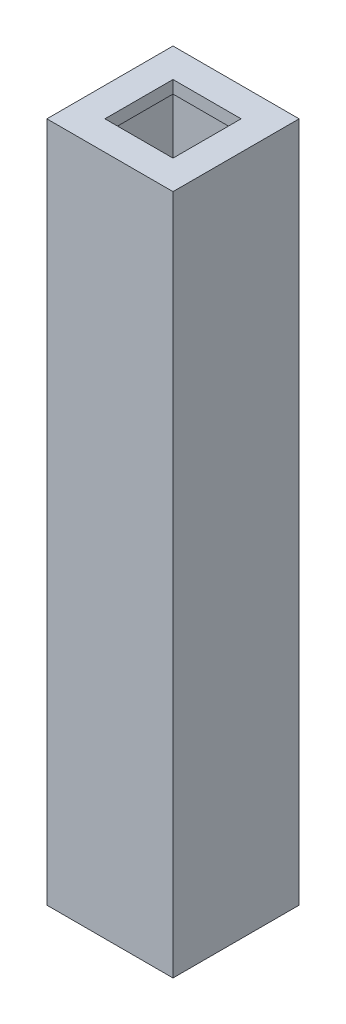
ISO-10303-21;
HEADER;
FILE_DESCRIPTION(('STEP AP214'),'2;1');
FILE_NAME('part.step','',(''),(''),'','','');
FILE_SCHEMA(('AUTOMOTIVE_DESIGN { 1 0 10303 214 1 1 1 1 }'));
ENDSEC;
DATA;
#1=APPLICATION_CONTEXT('core data for automotive mechanical design processes');
#2=APPLICATION_PROTOCOL_DEFINITION('international standard','automotive_design',2000,#1);
#3=PRODUCT_CONTEXT('',#1,'mechanical');
#4=PRODUCT('Part','Part','',(#3));
#5=PRODUCT_RELATED_PRODUCT_CATEGORY('part','',(#4));
#6=PRODUCT_DEFINITION_FORMATION('','',#4);
#7=PRODUCT_DEFINITION_CONTEXT('part definition',#1,'design');
#8=PRODUCT_DEFINITION('design','',#6,#7);
#9=PRODUCT_DEFINITION_SHAPE('','',#8);
#10=(LENGTH_UNIT() NAMED_UNIT(*) SI_UNIT(.MILLI.,.METRE.));
#11=(NAMED_UNIT(*) PLANE_ANGLE_UNIT() SI_UNIT($,.RADIAN.));
#12=(NAMED_UNIT(*) SI_UNIT($,.STERADIAN.) SOLID_ANGLE_UNIT());
#13=UNCERTAINTY_MEASURE_WITH_UNIT(LENGTH_MEASURE(1.E-05),#10,'distance_accuracy_value','');
#14=(GEOMETRIC_REPRESENTATION_CONTEXT(3) GLOBAL_UNCERTAINTY_ASSIGNED_CONTEXT((#13)) GLOBAL_UNIT_ASSIGNED_CONTEXT((#10,
#11,#12)) REPRESENTATION_CONTEXT('',''));
#15=CARTESIAN_POINT('',(0.,0.,0.));
#16=DIRECTION('',(0.,0.,1.));
#17=DIRECTION('',(1.,0.,0.));
#18=AXIS2_PLACEMENT_3D('',#15,#16,#17);
#19=CARTESIAN_POINT('',(0.,54.,-3.1));
#20=DIRECTION('',(0.,0.,-1.));
#21=DIRECTION('',(-1.,0.,0.));
#22=AXIS2_PLACEMENT_3D('',#19,#20,#21);
#23=PLANE('',#22);
#24=DIRECTION('',(0.,-1.,0.));
#25=VECTOR('',#24,1.);
#26=CARTESIAN_POINT('',(3.1,54.,-3.1));
#27=LINE('',#26,#25);
#28=CARTESIAN_POINT('',(3.1,53.,-3.1));
#29=VERTEX_POINT('',#28);
#30=CARTESIAN_POINT('',(3.1,0.,-3.1));
#31=VERTEX_POINT('',#30);
#32=EDGE_CURVE('E69',#29,#31,#27,.T.);
#33=ORIENTED_EDGE('',*,*,#32,.F.);
#34=DIRECTION('',(-1.,0.,0.));
#35=VECTOR('',#34,1.);
#36=CARTESIAN_POINT('',(0.,53.,-3.1));
#37=LINE('',#36,#35);
#38=CARTESIAN_POINT('',(-3.1,53.,-3.1));
#39=VERTEX_POINT('',#38);
#40=EDGE_CURVE('E199',#29,#39,#37,.T.);
#41=ORIENTED_EDGE('',*,*,#40,.T.);
#42=DIRECTION('',(0.,-1.,0.));
#43=VECTOR('',#42,1.);
#44=CARTESIAN_POINT('',(-3.1,54.,-3.1));
#45=LINE('',#44,#43);
#46=CARTESIAN_POINT('',(-3.1,0.,-3.1));
#47=VERTEX_POINT('',#46);
#48=EDGE_CURVE('E237',#39,#47,#45,.T.);
#49=ORIENTED_EDGE('',*,*,#48,.T.);
#50=DIRECTION('',(1.,0.,0.));
#51=VECTOR('',#50,1.);
#52=CARTESIAN_POINT('',(0.,0.,-3.1));
#53=LINE('',#52,#51);
#54=EDGE_CURVE('E226',#47,#31,#53,.T.);
#55=ORIENTED_EDGE('',*,*,#54,.T.);
#56=EDGE_LOOP('',(#33,#41,#49,#55));
#57=FACE_BOUND('',#56,.T.);
#58=ADVANCED_FACE('F61',(#57),#23,.F.);
#59=CARTESIAN_POINT('',(3.1,54.,0.));
#60=DIRECTION('',(1.,0.,0.));
#61=DIRECTION('',(0.,0.,-1.));
#62=AXIS2_PLACEMENT_3D('',#59,#60,#61);
#63=PLANE('',#62);
#64=DIRECTION('',(0.,-1.,0.));
#65=VECTOR('',#64,1.);
#66=CARTESIAN_POINT('',(3.1,54.,3.1));
#67=LINE('',#66,#65);
#68=CARTESIAN_POINT('',(3.1,53.,3.1));
#69=VERTEX_POINT('',#68);
#70=CARTESIAN_POINT('',(3.1,0.,3.1));
#71=VERTEX_POINT('',#70);
#72=EDGE_CURVE('E242',#69,#71,#67,.T.);
#73=ORIENTED_EDGE('',*,*,#72,.F.);
#74=DIRECTION('',(0.,0.,-1.));
#75=VECTOR('',#74,1.);
#76=CARTESIAN_POINT('',(3.1,53.,0.));
#77=LINE('',#76,#75);
#78=EDGE_CURVE('E76',#69,#29,#77,.T.);
#79=ORIENTED_EDGE('',*,*,#78,.T.);
#80=ORIENTED_EDGE('',*,*,#32,.T.);
#81=DIRECTION('',(0.,0.,1.));
#82=VECTOR('',#81,1.);
#83=CARTESIAN_POINT('',(3.1,0.,0.));
#84=LINE('',#83,#82);
#85=EDGE_CURVE('E229',#31,#71,#84,.T.);
#86=ORIENTED_EDGE('',*,*,#85,.T.);
#87=EDGE_LOOP('',(#73,#79,#80,#86));
#88=FACE_BOUND('',#87,.T.);
#89=ADVANCED_FACE('F284',(#88),#63,.F.);
#90=CARTESIAN_POINT('',(0.,54.,3.1));
#91=DIRECTION('',(0.,0.,-1.));
#92=DIRECTION('',(-1.,0.,0.));
#93=AXIS2_PLACEMENT_3D('',#90,#91,#92);
#94=PLANE('',#93);
#95=DIRECTION('',(-1.,0.,0.));
#96=VECTOR('',#95,1.);
#97=CARTESIAN_POINT('',(0.,53.,3.1));
#98=LINE('',#97,#96);
#99=CARTESIAN_POINT('',(-3.1,53.,3.1));
#100=VERTEX_POINT('',#99);
#101=EDGE_CURVE('E84',#69,#100,#98,.T.);
#102=ORIENTED_EDGE('',*,*,#101,.F.);
#103=ORIENTED_EDGE('',*,*,#72,.T.);
#104=DIRECTION('',(1.,0.,0.));
#105=VECTOR('',#104,1.);
#106=CARTESIAN_POINT('',(0.,0.,3.1));
#107=LINE('',#106,#105);
#108=CARTESIAN_POINT('',(-3.1,0.,3.1));
#109=VERTEX_POINT('',#108);
#110=EDGE_CURVE('E232',#109,#71,#107,.T.);
#111=ORIENTED_EDGE('',*,*,#110,.F.);
#112=DIRECTION('',(0.,-1.,0.));
#113=VECTOR('',#112,1.);
#114=CARTESIAN_POINT('',(-3.1,54.,3.1));
#115=LINE('',#114,#113);
#116=EDGE_CURVE('E239',#100,#109,#115,.T.);
#117=ORIENTED_EDGE('',*,*,#116,.F.);
#118=EDGE_LOOP('',(#102,#103,#111,#117));
#119=FACE_BOUND('',#118,.T.);
#120=ADVANCED_FACE('F289',(#119),#94,.T.);
#121=CARTESIAN_POINT('',(5.,54.,0.));
#122=DIRECTION('',(1.,0.,0.));
#123=DIRECTION('',(0.,0.,-1.));
#124=AXIS2_PLACEMENT_3D('',#121,#122,#123);
#125=PLANE('',#124);
#126=DIRECTION('',(0.,0.,1.));
#127=VECTOR('',#126,1.);
#128=CARTESIAN_POINT('',(5.,0.,0.));
#129=LINE('',#128,#127);
#130=CARTESIAN_POINT('',(5.,0.,-5.));
#131=VERTEX_POINT('',#130);
#132=CARTESIAN_POINT('',(5.,0.,5.));
#133=VERTEX_POINT('',#132);
#134=EDGE_CURVE('E202',#131,#133,#129,.T.);
#135=ORIENTED_EDGE('',*,*,#134,.F.);
#136=DIRECTION('',(0.,-1.,0.));
#137=VECTOR('',#136,1.);
#138=CARTESIAN_POINT('',(5.,54.,-5.));
#139=LINE('',#138,#137);
#140=CARTESIAN_POINT('',(5.,54.,-5.));
#141=VERTEX_POINT('',#140);
#142=EDGE_CURVE('E240',#141,#131,#139,.T.);
#143=ORIENTED_EDGE('',*,*,#142,.F.);
#144=DIRECTION('',(0.,0.,1.));
#145=VECTOR('',#144,1.);
#146=CARTESIAN_POINT('',(5.,54.,0.));
#147=LINE('',#146,#145);
#148=CARTESIAN_POINT('',(5.,54.,5.));
#149=VERTEX_POINT('',#148);
#150=EDGE_CURVE('E203',#141,#149,#147,.T.);
#151=ORIENTED_EDGE('',*,*,#150,.T.);
#152=DIRECTION('',(0.,-1.,0.));
#153=VECTOR('',#152,1.);
#154=CARTESIAN_POINT('',(5.,54.,5.));
#155=LINE('',#154,#153);
#156=EDGE_CURVE('E214',#149,#133,#155,.T.);
#157=ORIENTED_EDGE('',*,*,#156,.T.);
#158=EDGE_LOOP('',(#135,#143,#151,#157));
#159=FACE_BOUND('',#158,.T.);
#160=ADVANCED_FACE('F63',(#159),#125,.T.);
#161=CARTESIAN_POINT('',(0.,54.,-5.));
#162=DIRECTION('',(0.,0.,-1.));
#163=DIRECTION('',(-1.,0.,0.));
#164=AXIS2_PLACEMENT_3D('',#161,#162,#163);
#165=PLANE('',#164);
#166=DIRECTION('',(1.,0.,0.));
#167=VECTOR('',#166,1.);
#168=CARTESIAN_POINT('',(0.,0.,-5.));
#169=LINE('',#168,#167);
#170=CARTESIAN_POINT('',(-5.,0.,-5.));
#171=VERTEX_POINT('',#170);
#172=EDGE_CURVE('E217',#171,#131,#169,.T.);
#173=ORIENTED_EDGE('',*,*,#172,.F.);
#174=DIRECTION('',(0.,-1.,0.));
#175=VECTOR('',#174,1.);
#176=CARTESIAN_POINT('',(-5.,54.,-5.));
#177=LINE('',#176,#175);
#178=CARTESIAN_POINT('',(-5.,54.,-5.));
#179=VERTEX_POINT('',#178);
#180=EDGE_CURVE('E248',#179,#171,#177,.T.);
#181=ORIENTED_EDGE('',*,*,#180,.F.);
#182=DIRECTION('',(1.,0.,0.));
#183=VECTOR('',#182,1.);
#184=CARTESIAN_POINT('',(0.,54.,-5.));
#185=LINE('',#184,#183);
#186=EDGE_CURVE('E206',#179,#141,#185,.T.);
#187=ORIENTED_EDGE('',*,*,#186,.T.);
#188=ORIENTED_EDGE('',*,*,#142,.T.);
#189=EDGE_LOOP('',(#173,#181,#187,#188));
#190=FACE_BOUND('',#189,.T.);
#191=ADVANCED_FACE('F252',(#190),#165,.T.);
#192=CARTESIAN_POINT('',(-5.,54.,0.));
#193=DIRECTION('',(1.,0.,0.));
#194=DIRECTION('',(0.,0.,-1.));
#195=AXIS2_PLACEMENT_3D('',#192,#193,#194);
#196=PLANE('',#195);
#197=DIRECTION('',(0.,0.,1.));
#198=VECTOR('',#197,1.);
#199=CARTESIAN_POINT('',(-5.,0.,0.));
#200=LINE('',#199,#198);
#201=CARTESIAN_POINT('',(-5.,0.,5.));
#202=VERTEX_POINT('',#201);
#203=EDGE_CURVE('E220',#171,#202,#200,.T.);
#204=ORIENTED_EDGE('',*,*,#203,.T.);
#205=DIRECTION('',(0.,-1.,0.));
#206=VECTOR('',#205,1.);
#207=CARTESIAN_POINT('',(-5.,54.,5.));
#208=LINE('',#207,#206);
#209=CARTESIAN_POINT('',(-5.,54.,5.));
#210=VERTEX_POINT('',#209);
#211=EDGE_CURVE('E246',#210,#202,#208,.T.);
#212=ORIENTED_EDGE('',*,*,#211,.F.);
#213=DIRECTION('',(0.,0.,1.));
#214=VECTOR('',#213,1.);
#215=CARTESIAN_POINT('',(-5.,54.,0.));
#216=LINE('',#215,#214);
#217=EDGE_CURVE('E210',#179,#210,#216,.T.);
#218=ORIENTED_EDGE('',*,*,#217,.F.);
#219=ORIENTED_EDGE('',*,*,#180,.T.);
#220=EDGE_LOOP('',(#204,#212,#218,#219));
#221=FACE_BOUND('',#220,.T.);
#222=ADVANCED_FACE('F264',(#221),#196,.F.);
#223=CARTESIAN_POINT('',(0.,54.,5.));
#224=DIRECTION('',(0.,0.,-1.));
#225=DIRECTION('',(-1.,0.,0.));
#226=AXIS2_PLACEMENT_3D('',#223,#224,#225);
#227=PLANE('',#226);
#228=DIRECTION('',(1.,0.,0.));
#229=VECTOR('',#228,1.);
#230=CARTESIAN_POINT('',(0.,0.,5.));
#231=LINE('',#230,#229);
#232=EDGE_CURVE('E223',#202,#133,#231,.T.);
#233=ORIENTED_EDGE('',*,*,#232,.T.);
#234=ORIENTED_EDGE('',*,*,#156,.F.);
#235=DIRECTION('',(1.,0.,0.));
#236=VECTOR('',#235,1.);
#237=CARTESIAN_POINT('',(0.,54.,5.));
#238=LINE('',#237,#236);
#239=EDGE_CURVE('E212',#210,#149,#238,.T.);
#240=ORIENTED_EDGE('',*,*,#239,.F.);
#241=ORIENTED_EDGE('',*,*,#211,.T.);
#242=EDGE_LOOP('',(#233,#234,#240,#241));
#243=FACE_BOUND('',#242,.T.);
#244=ADVANCED_FACE('F271',(#243),#227,.F.);
#245=CARTESIAN_POINT('',(-3.1,54.,0.));
#246=DIRECTION('',(1.,0.,0.));
#247=DIRECTION('',(0.,0.,-1.));
#248=AXIS2_PLACEMENT_3D('',#245,#246,#247);
#249=PLANE('',#248);
#250=DIRECTION('',(0.,0.,-1.));
#251=VECTOR('',#250,1.);
#252=CARTESIAN_POINT('',(-3.1,53.,0.));
#253=LINE('',#252,#251);
#254=EDGE_CURVE('E12',#100,#39,#253,.T.);
#255=ORIENTED_EDGE('',*,*,#254,.F.);
#256=ORIENTED_EDGE('',*,*,#116,.T.);
#257=DIRECTION('',(0.,0.,1.));
#258=VECTOR('',#257,1.);
#259=CARTESIAN_POINT('',(-3.1,0.,0.));
#260=LINE('',#259,#258);
#261=EDGE_CURVE('E207',#47,#109,#260,.T.);
#262=ORIENTED_EDGE('',*,*,#261,.F.);
#263=ORIENTED_EDGE('',*,*,#48,.F.);
#264=EDGE_LOOP('',(#255,#256,#262,#263));
#265=FACE_BOUND('',#264,.T.);
#266=ADVANCED_FACE('F273',(#265),#249,.T.);
#267=CARTESIAN_POINT('',(0.,54.,0.));
#268=DIRECTION('',(0.,1.,0.));
#269=DIRECTION('',(0.,0.,1.));
#270=AXIS2_PLACEMENT_3D('',#267,#268,#269);
#271=PLANE('',#270);
#272=ORIENTED_EDGE('',*,*,#150,.F.);
#273=ORIENTED_EDGE('',*,*,#186,.F.);
#274=ORIENTED_EDGE('',*,*,#217,.T.);
#275=ORIENTED_EDGE('',*,*,#239,.T.);
#276=EDGE_LOOP('',(#272,#273,#274,#275));
#277=FACE_BOUND('',#276,.T.);
#278=DIRECTION('',(0.,0.,1.));
#279=VECTOR('',#278,1.);
#280=CARTESIAN_POINT('',(-2.7,54.,0.));
#281=LINE('',#280,#279);
#282=CARTESIAN_POINT('',(-2.7,54.,-2.7));
#283=VERTEX_POINT('',#282);
#284=CARTESIAN_POINT('',(-2.7,54.,2.7));
#285=VERTEX_POINT('',#284);
#286=EDGE_CURVE('E187',#283,#285,#281,.T.);
#287=ORIENTED_EDGE('',*,*,#286,.F.);
#288=DIRECTION('',(-1.,0.,0.));
#289=VECTOR('',#288,1.);
#290=CARTESIAN_POINT('',(0.,54.,-2.7));
#291=LINE('',#290,#289);
#292=CARTESIAN_POINT('',(2.7,54.,-2.7));
#293=VERTEX_POINT('',#292);
#294=EDGE_CURVE('E158',#293,#283,#291,.T.);
#295=ORIENTED_EDGE('',*,*,#294,.F.);
#296=DIRECTION('',(0.,0.,1.));
#297=VECTOR('',#296,1.);
#298=CARTESIAN_POINT('',(2.7,54.,0.));
#299=LINE('',#298,#297);
#300=CARTESIAN_POINT('',(2.7,54.,2.7));
#301=VERTEX_POINT('',#300);
#302=EDGE_CURVE('E175',#293,#301,#299,.T.);
#303=ORIENTED_EDGE('',*,*,#302,.T.);
#304=DIRECTION('',(-1.,0.,0.));
#305=VECTOR('',#304,1.);
#306=CARTESIAN_POINT('',(0.,54.,2.7));
#307=LINE('',#306,#305);
#308=EDGE_CURVE('E178',#301,#285,#307,.T.);
#309=ORIENTED_EDGE('',*,*,#308,.T.);
#310=EDGE_LOOP('',(#287,#295,#303,#309));
#311=FACE_BOUND('',#310,.T.);
#312=ADVANCED_FACE('F268',(#277,#311),#271,.T.);
#313=CARTESIAN_POINT('',(0.,0.,0.));
#314=DIRECTION('',(0.,1.,0.));
#315=DIRECTION('',(0.,0.,1.));
#316=AXIS2_PLACEMENT_3D('',#313,#314,#315);
#317=PLANE('',#316);
#318=CARTESIAN_POINT('',(4.,0.,4.));
#319=DIRECTION('',(0.,-1.,0.));
#320=DIRECTION('',(0.,0.,-1.));
#321=AXIS2_PLACEMENT_3D('',#318,#319,#320);
#322=CIRCLE('',#321,0.3);
#323=CARTESIAN_POINT('',(4.,0.,3.7));
#324=VERTEX_POINT('',#323);
#325=EDGE_CURVE('E361',#324,#324,#322,.T.);
#326=ORIENTED_EDGE('',*,*,#325,.F.);
#327=EDGE_LOOP('',(#326));
#328=FACE_BOUND('',#327,.T.);
#329=CARTESIAN_POINT('',(-4.,0.,-4.));
#330=DIRECTION('',(0.,-1.,0.));
#331=DIRECTION('',(0.,0.,-1.));
#332=AXIS2_PLACEMENT_3D('',#329,#330,#331);
#333=CIRCLE('',#332,0.3);
#334=CARTESIAN_POINT('',(-4.,0.,-4.3));
#335=VERTEX_POINT('',#334);
#336=EDGE_CURVE('E357',#335,#335,#333,.T.);
#337=ORIENTED_EDGE('',*,*,#336,.F.);
#338=EDGE_LOOP('',(#337));
#339=FACE_BOUND('',#338,.T.);
#340=CARTESIAN_POINT('',(4.,0.,-4.));
#341=DIRECTION('',(0.,-1.,0.));
#342=DIRECTION('',(0.,0.,-1.));
#343=AXIS2_PLACEMENT_3D('',#340,#341,#342);
#344=CIRCLE('',#343,0.3);
#345=CARTESIAN_POINT('',(4.,0.,-4.3));
#346=VERTEX_POINT('',#345);
#347=EDGE_CURVE('E352',#346,#346,#344,.T.);
#348=ORIENTED_EDGE('',*,*,#347,.F.);
#349=EDGE_LOOP('',(#348));
#350=FACE_BOUND('',#349,.T.);
#351=CARTESIAN_POINT('',(-4.,0.,4.));
#352=DIRECTION('',(0.,-1.,0.));
#353=DIRECTION('',(0.,0.,-1.));
#354=AXIS2_PLACEMENT_3D('',#351,#352,#353);
#355=CIRCLE('',#354,0.3);
#356=CARTESIAN_POINT('',(-4.,0.,3.7));
#357=VERTEX_POINT('',#356);
#358=EDGE_CURVE('E181',#357,#357,#355,.T.);
#359=ORIENTED_EDGE('',*,*,#358,.F.);
#360=EDGE_LOOP('',(#359));
#361=FACE_BOUND('',#360,.T.);
#362=ORIENTED_EDGE('',*,*,#134,.T.);
#363=ORIENTED_EDGE('',*,*,#232,.F.);
#364=ORIENTED_EDGE('',*,*,#203,.F.);
#365=ORIENTED_EDGE('',*,*,#172,.T.);
#366=EDGE_LOOP('',(#362,#363,#364,#365));
#367=FACE_BOUND('',#366,.T.);
#368=ORIENTED_EDGE('',*,*,#54,.F.);
#369=ORIENTED_EDGE('',*,*,#261,.T.);
#370=ORIENTED_EDGE('',*,*,#110,.T.);
#371=ORIENTED_EDGE('',*,*,#85,.F.);
#372=EDGE_LOOP('',(#368,#369,#370,#371));
#373=FACE_BOUND('',#372,.T.);
#374=ADVANCED_FACE('F260',(#328,#339,#350,#361,#367,#373),#317,.F.);
#375=CARTESIAN_POINT('',(0.,53.,0.));
#376=DIRECTION('',(0.,-1.,0.));
#377=DIRECTION('',(0.,0.,-1.));
#378=AXIS2_PLACEMENT_3D('',#375,#376,#377);
#379=PLANE('',#378);
#380=DIRECTION('',(-1.,0.,0.));
#381=VECTOR('',#380,1.);
#382=CARTESIAN_POINT('',(0.,53.,-2.7));
#383=LINE('',#382,#381);
#384=CARTESIAN_POINT('',(2.7,53.,-2.7));
#385=VERTEX_POINT('',#384);
#386=CARTESIAN_POINT('',(-2.7,53.,-2.7));
#387=VERTEX_POINT('',#386);
#388=EDGE_CURVE('E155',#385,#387,#383,.T.);
#389=ORIENTED_EDGE('',*,*,#388,.T.);
#390=DIRECTION('',(0.,0.,1.));
#391=VECTOR('',#390,1.);
#392=CARTESIAN_POINT('',(-2.7,53.,0.));
#393=LINE('',#392,#391);
#394=CARTESIAN_POINT('',(-2.7,53.,2.7));
#395=VERTEX_POINT('',#394);
#396=EDGE_CURVE('E166',#387,#395,#393,.T.);
#397=ORIENTED_EDGE('',*,*,#396,.T.);
#398=DIRECTION('',(-1.,0.,0.));
#399=VECTOR('',#398,1.);
#400=CARTESIAN_POINT('',(0.,53.,2.7));
#401=LINE('',#400,#399);
#402=CARTESIAN_POINT('',(2.7,53.,2.7));
#403=VERTEX_POINT('',#402);
#404=EDGE_CURVE('E171',#403,#395,#401,.T.);
#405=ORIENTED_EDGE('',*,*,#404,.F.);
#406=DIRECTION('',(0.,0.,1.));
#407=VECTOR('',#406,1.);
#408=CARTESIAN_POINT('',(2.7,53.,0.));
#409=LINE('',#408,#407);
#410=EDGE_CURVE('E163',#385,#403,#409,.T.);
#411=ORIENTED_EDGE('',*,*,#410,.F.);
#412=EDGE_LOOP('',(#389,#397,#405,#411));
#413=FACE_BOUND('',#412,.T.);
#414=ORIENTED_EDGE('',*,*,#40,.F.);
#415=ORIENTED_EDGE('',*,*,#78,.F.);
#416=ORIENTED_EDGE('',*,*,#101,.T.);
#417=ORIENTED_EDGE('',*,*,#254,.T.);
#418=EDGE_LOOP('',(#414,#415,#416,#417));
#419=FACE_BOUND('',#418,.T.);
#420=ADVANCED_FACE('F173',(#413,#419),#379,.T.);
#421=CARTESIAN_POINT('',(0.,53.,-2.7));
#422=DIRECTION('',(0.,0.,-1.));
#423=DIRECTION('',(-1.,0.,0.));
#424=AXIS2_PLACEMENT_3D('',#421,#422,#423);
#425=PLANE('',#424);
#426=ORIENTED_EDGE('',*,*,#294,.T.);
#427=DIRECTION('',(0.,1.,0.));
#428=VECTOR('',#427,1.);
#429=CARTESIAN_POINT('',(-2.7,53.,-2.7));
#430=LINE('',#429,#428);
#431=EDGE_CURVE('E151',#387,#283,#430,.T.);
#432=ORIENTED_EDGE('',*,*,#431,.F.);
#433=ORIENTED_EDGE('',*,*,#388,.F.);
#434=DIRECTION('',(0.,1.,0.));
#435=VECTOR('',#434,1.);
#436=CARTESIAN_POINT('',(2.7,53.,-2.7));
#437=LINE('',#436,#435);
#438=EDGE_CURVE('E192',#385,#293,#437,.T.);
#439=ORIENTED_EDGE('',*,*,#438,.T.);
#440=EDGE_LOOP('',(#426,#432,#433,#439));
#441=FACE_BOUND('',#440,.T.);
#442=ADVANCED_FACE('F153',(#441),#425,.F.);
#443=CARTESIAN_POINT('',(2.7,53.,0.));
#444=DIRECTION('',(-1.,0.,0.));
#445=DIRECTION('',(0.,0.,1.));
#446=AXIS2_PLACEMENT_3D('',#443,#444,#445);
#447=PLANE('',#446);
#448=ORIENTED_EDGE('',*,*,#302,.F.);
#449=ORIENTED_EDGE('',*,*,#438,.F.);
#450=ORIENTED_EDGE('',*,*,#410,.T.);
#451=DIRECTION('',(0.,1.,0.));
#452=VECTOR('',#451,1.);
#453=CARTESIAN_POINT('',(2.7,53.,2.7));
#454=LINE('',#453,#452);
#455=EDGE_CURVE('E194',#403,#301,#454,.T.);
#456=ORIENTED_EDGE('',*,*,#455,.T.);
#457=EDGE_LOOP('',(#448,#449,#450,#456));
#458=FACE_BOUND('',#457,.T.);
#459=ADVANCED_FACE('F303',(#458),#447,.T.);
#460=CARTESIAN_POINT('',(0.,53.,2.7));
#461=DIRECTION('',(0.,0.,-1.));
#462=DIRECTION('',(-1.,0.,0.));
#463=AXIS2_PLACEMENT_3D('',#460,#461,#462);
#464=PLANE('',#463);
#465=ORIENTED_EDGE('',*,*,#308,.F.);
#466=ORIENTED_EDGE('',*,*,#455,.F.);
#467=ORIENTED_EDGE('',*,*,#404,.T.);
#468=DIRECTION('',(0.,1.,0.));
#469=VECTOR('',#468,1.);
#470=CARTESIAN_POINT('',(-2.7,53.,2.7));
#471=LINE('',#470,#469);
#472=EDGE_CURVE('E162',#395,#285,#471,.T.);
#473=ORIENTED_EDGE('',*,*,#472,.T.);
#474=EDGE_LOOP('',(#465,#466,#467,#473));
#475=FACE_BOUND('',#474,.T.);
#476=ADVANCED_FACE('F307',(#475),#464,.T.);
#477=CARTESIAN_POINT('',(-2.7,53.,0.));
#478=DIRECTION('',(-1.,0.,0.));
#479=DIRECTION('',(0.,0.,1.));
#480=AXIS2_PLACEMENT_3D('',#477,#478,#479);
#481=PLANE('',#480);
#482=ORIENTED_EDGE('',*,*,#286,.T.);
#483=ORIENTED_EDGE('',*,*,#472,.F.);
#484=ORIENTED_EDGE('',*,*,#396,.F.);
#485=ORIENTED_EDGE('',*,*,#431,.T.);
#486=EDGE_LOOP('',(#482,#483,#484,#485));
#487=FACE_BOUND('',#486,.T.);
#488=ADVANCED_FACE('F167',(#487),#481,.F.);
#489=CARTESIAN_POINT('',(-4.,2.,4.));
#490=DIRECTION('',(0.,-1.,0.));
#491=DIRECTION('',(0.,0.,-1.));
#492=AXIS2_PLACEMENT_3D('',#489,#490,#491);
#493=CYLINDRICAL_SURFACE('',#492,0.3);
#494=CARTESIAN_POINT('',(-4.,2.,4.));
#495=DIRECTION('',(0.,-1.,0.));
#496=DIRECTION('',(0.,0.,-1.));
#497=AXIS2_PLACEMENT_3D('',#494,#495,#496);
#498=CIRCLE('',#497,0.3);
#499=CARTESIAN_POINT('',(-4.,2.,3.7));
#500=VERTEX_POINT('',#499);
#501=EDGE_CURVE('E188',#500,#500,#498,.T.);
#502=ORIENTED_EDGE('',*,*,#501,.F.);
#503=EDGE_LOOP('',(#502));
#504=FACE_BOUND('',#503,.T.);
#505=ORIENTED_EDGE('',*,*,#358,.T.);
#506=EDGE_LOOP('',(#505));
#507=FACE_BOUND('',#506,.T.);
#508=ADVANCED_FACE('F306',(#504,#507),#493,.F.);
#509=CARTESIAN_POINT('',(-4.,2.,4.));
#510=DIRECTION('',(0.,-1.,0.));
#511=DIRECTION('',(0.,0.,-1.));
#512=AXIS2_PLACEMENT_3D('',#509,#510,#511);
#513=PLANE('',#512);
#514=ORIENTED_EDGE('',*,*,#501,.T.);
#515=EDGE_LOOP('',(#514));
#516=FACE_BOUND('',#515,.T.);
#517=ADVANCED_FACE('F316',(#516),#513,.T.);
#518=CARTESIAN_POINT('',(4.,2.,-4.));
#519=DIRECTION('',(0.,-1.,0.));
#520=DIRECTION('',(0.,0.,-1.));
#521=AXIS2_PLACEMENT_3D('',#518,#519,#520);
#522=CYLINDRICAL_SURFACE('',#521,0.3);
#523=CARTESIAN_POINT('',(4.,2.,-4.));
#524=DIRECTION('',(0.,-1.,0.));
#525=DIRECTION('',(0.,0.,-1.));
#526=AXIS2_PLACEMENT_3D('',#523,#524,#525);
#527=CIRCLE('',#526,0.3);
#528=CARTESIAN_POINT('',(4.,2.,-4.3));
#529=VERTEX_POINT('',#528);
#530=EDGE_CURVE('E349',#529,#529,#527,.T.);
#531=ORIENTED_EDGE('',*,*,#530,.F.);
#532=EDGE_LOOP('',(#531));
#533=FACE_BOUND('',#532,.T.);
#534=ORIENTED_EDGE('',*,*,#347,.T.);
#535=EDGE_LOOP('',(#534));
#536=FACE_BOUND('',#535,.T.);
#537=ADVANCED_FACE('F320',(#533,#536),#522,.F.);
#538=CARTESIAN_POINT('',(4.,2.,-4.));
#539=DIRECTION('',(0.,-1.,0.));
#540=DIRECTION('',(0.,0.,-1.));
#541=AXIS2_PLACEMENT_3D('',#538,#539,#540);
#542=PLANE('',#541);
#543=ORIENTED_EDGE('',*,*,#530,.T.);
#544=EDGE_LOOP('',(#543));
#545=FACE_BOUND('',#544,.T.);
#546=ADVANCED_FACE('F330',(#545),#542,.T.);
#547=CARTESIAN_POINT('',(-4.,2.,-4.));
#548=DIRECTION('',(0.,-1.,0.));
#549=DIRECTION('',(0.,0.,-1.));
#550=AXIS2_PLACEMENT_3D('',#547,#548,#549);
#551=CYLINDRICAL_SURFACE('',#550,0.3);
#552=CARTESIAN_POINT('',(-4.,2.,-4.));
#553=DIRECTION('',(0.,-1.,0.));
#554=DIRECTION('',(0.,0.,-1.));
#555=AXIS2_PLACEMENT_3D('',#552,#553,#554);
#556=CIRCLE('',#555,0.3);
#557=CARTESIAN_POINT('',(-4.,2.,-4.3));
#558=VERTEX_POINT('',#557);
#559=EDGE_CURVE('E354',#558,#558,#556,.T.);
#560=ORIENTED_EDGE('',*,*,#559,.F.);
#561=EDGE_LOOP('',(#560));
#562=FACE_BOUND('',#561,.T.);
#563=ORIENTED_EDGE('',*,*,#336,.T.);
#564=EDGE_LOOP('',(#563));
#565=FACE_BOUND('',#564,.T.);
#566=ADVANCED_FACE('F326',(#562,#565),#551,.F.);
#567=CARTESIAN_POINT('',(-4.,2.,-4.));
#568=DIRECTION('',(0.,-1.,0.));
#569=DIRECTION('',(0.,0.,-1.));
#570=AXIS2_PLACEMENT_3D('',#567,#568,#569);
#571=PLANE('',#570);
#572=ORIENTED_EDGE('',*,*,#559,.T.);
#573=EDGE_LOOP('',(#572));
#574=FACE_BOUND('',#573,.T.);
#575=ADVANCED_FACE('F322',(#574),#571,.T.);
#576=CARTESIAN_POINT('',(4.,2.,4.));
#577=DIRECTION('',(0.,-1.,0.));
#578=DIRECTION('',(0.,0.,-1.));
#579=AXIS2_PLACEMENT_3D('',#576,#577,#578);
#580=CYLINDRICAL_SURFACE('',#579,0.3);
#581=CARTESIAN_POINT('',(4.,2.,4.));
#582=DIRECTION('',(0.,-1.,0.));
#583=DIRECTION('',(0.,0.,-1.));
#584=AXIS2_PLACEMENT_3D('',#581,#582,#583);
#585=CIRCLE('',#584,0.3);
#586=CARTESIAN_POINT('',(4.,2.,3.7));
#587=VERTEX_POINT('',#586);
#588=EDGE_CURVE('E364',#587,#587,#585,.T.);
#589=ORIENTED_EDGE('',*,*,#588,.F.);
#590=EDGE_LOOP('',(#589));
#591=FACE_BOUND('',#590,.T.);
#592=ORIENTED_EDGE('',*,*,#325,.T.);
#593=EDGE_LOOP('',(#592));
#594=FACE_BOUND('',#593,.T.);
#595=ADVANCED_FACE('F325',(#591,#594),#580,.F.);
#596=CARTESIAN_POINT('',(4.,2.,4.));
#597=DIRECTION('',(0.,-1.,0.));
#598=DIRECTION('',(0.,0.,-1.));
#599=AXIS2_PLACEMENT_3D('',#596,#597,#598);
#600=PLANE('',#599);
#601=ORIENTED_EDGE('',*,*,#588,.T.);
#602=EDGE_LOOP('',(#601));
#603=FACE_BOUND('',#602,.T.);
#604=ADVANCED_FACE('F332',(#603),#600,.T.);
#605=CLOSED_SHELL('',(#58,#89,#120,#160,#191,#222,#244,#266,#312,#374,#420,#442,#459,#476,#488,
#508,#517,#537,#546,#566,#575,#595,#604));
#606=MANIFOLD_SOLID_BREP('B2',#605);
#607=ADVANCED_BREP_SHAPE_REPRESENTATION('',(#18,#606),#14);
#608=SHAPE_DEFINITION_REPRESENTATION(#9,#607);
ENDSEC;
END-ISO-10303-21;
